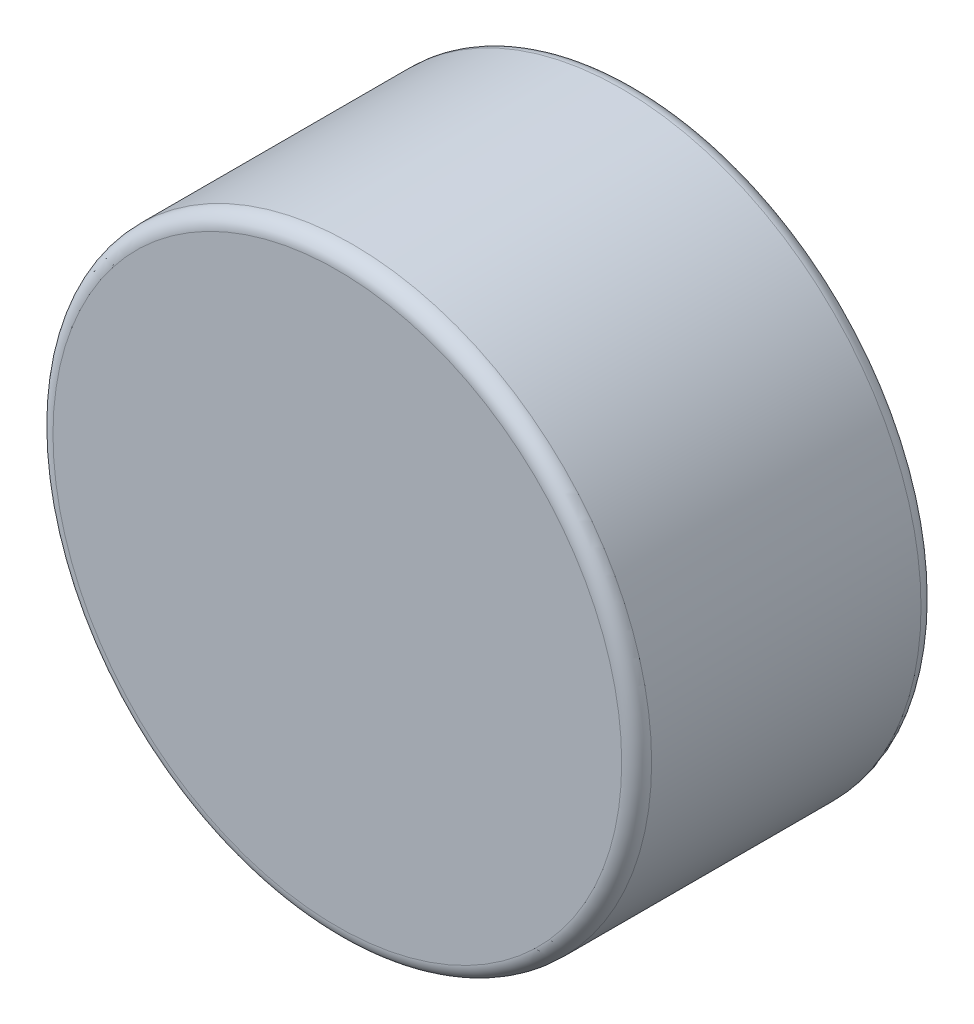
ISO-10303-21;
HEADER;
FILE_DESCRIPTION(('STEP AP214'),'2;1');
FILE_NAME('part.step','',(''),(''),'','','');
FILE_SCHEMA(('AUTOMOTIVE_DESIGN { 1 0 10303 214 1 1 1 1 }'));
ENDSEC;
DATA;
#1=APPLICATION_CONTEXT('core data for automotive mechanical design processes');
#2=APPLICATION_PROTOCOL_DEFINITION('international standard','automotive_design',2000,#1);
#3=PRODUCT_CONTEXT('',#1,'mechanical');
#4=PRODUCT('Part','Part','',(#3));
#5=PRODUCT_RELATED_PRODUCT_CATEGORY('part','',(#4));
#6=PRODUCT_DEFINITION_FORMATION('','',#4);
#7=PRODUCT_DEFINITION_CONTEXT('part definition',#1,'design');
#8=PRODUCT_DEFINITION('design','',#6,#7);
#9=PRODUCT_DEFINITION_SHAPE('','',#8);
#10=(LENGTH_UNIT() NAMED_UNIT(*) SI_UNIT(.MILLI.,.METRE.));
#11=(NAMED_UNIT(*) PLANE_ANGLE_UNIT() SI_UNIT($,.RADIAN.));
#12=(NAMED_UNIT(*) SI_UNIT($,.STERADIAN.) SOLID_ANGLE_UNIT());
#13=UNCERTAINTY_MEASURE_WITH_UNIT(LENGTH_MEASURE(1.E-05),#10,'distance_accuracy_value','');
#14=(GEOMETRIC_REPRESENTATION_CONTEXT(3) GLOBAL_UNCERTAINTY_ASSIGNED_CONTEXT((#13)) GLOBAL_UNIT_ASSIGNED_CONTEXT((#10,
#11,#12)) REPRESENTATION_CONTEXT('',''));
#15=CARTESIAN_POINT('',(0.,0.,0.));
#16=DIRECTION('',(0.,0.,1.));
#17=DIRECTION('',(1.,0.,0.));
#18=AXIS2_PLACEMENT_3D('',#15,#16,#17);
#19=CARTESIAN_POINT('',(0.,0.,0.));
#20=DIRECTION('',(0.,0.,-1.));
#21=DIRECTION('',(-1.,0.,0.));
#22=AXIS2_PLACEMENT_3D('',#19,#20,#21);
#23=PLANE('',#22);
#24=CARTESIAN_POINT('',(0.,0.,0.));
#25=DIRECTION('',(0.,0.,-1.));
#26=DIRECTION('',(-1.,0.,0.));
#27=AXIS2_PLACEMENT_3D('',#24,#25,#26);
#28=CIRCLE('',#27,1.9);
#29=CARTESIAN_POINT('',(-1.9,0.,0.));
#30=VERTEX_POINT('',#29);
#31=EDGE_CURVE('E10',#30,#30,#28,.F.);
#32=ORIENTED_EDGE('',*,*,#31,.T.);
#33=EDGE_LOOP('',(#32));
#34=FACE_BOUND('',#33,.T.);
#35=ADVANCED_FACE('F31',(#34),#23,.F.);
#36=CARTESIAN_POINT('',(0.,0.,9.21400778210117));
#37=DIRECTION('',(0.,0.,1.));
#38=DIRECTION('',(1.,0.,0.));
#39=AXIS2_PLACEMENT_3D('',#36,#37,#38);
#40=CYLINDRICAL_SURFACE('',#39,2.);
#41=CARTESIAN_POINT('',(0.,0.,-1.9));
#42=DIRECTION('',(0.,0.,1.));
#43=DIRECTION('',(1.,0.,0.));
#44=AXIS2_PLACEMENT_3D('',#41,#42,#43);
#45=CIRCLE('',#44,2.);
#46=CARTESIAN_POINT('',(2.,0.,-1.9));
#47=VERTEX_POINT('',#46);
#48=EDGE_CURVE('E42',#47,#47,#45,.T.);
#49=ORIENTED_EDGE('',*,*,#48,.T.);
#50=EDGE_LOOP('',(#49));
#51=FACE_BOUND('',#50,.T.);
#52=CARTESIAN_POINT('',(0.,0.,-0.0999999999999994));
#53=DIRECTION('',(0.,0.,-1.));
#54=DIRECTION('',(-1.,0.,0.));
#55=AXIS2_PLACEMENT_3D('',#52,#53,#54);
#56=CIRCLE('',#55,2.);
#57=CARTESIAN_POINT('',(-2.,0.,-0.0999999999999994));
#58=VERTEX_POINT('',#57);
#59=EDGE_CURVE('E46',#58,#58,#56,.T.);
#60=ORIENTED_EDGE('',*,*,#59,.T.);
#61=EDGE_LOOP('',(#60));
#62=FACE_BOUND('',#61,.T.);
#63=ADVANCED_FACE('F52',(#51,#62),#40,.T.);
#64=CARTESIAN_POINT('',(0.,0.,-2.));
#65=DIRECTION('',(0.,0.,1.));
#66=DIRECTION('',(1.,0.,0.));
#67=AXIS2_PLACEMENT_3D('',#64,#65,#66);
#68=PLANE('',#67);
#69=CARTESIAN_POINT('',(0.,0.,-2.));
#70=DIRECTION('',(0.,0.,1.));
#71=DIRECTION('',(1.,0.,0.));
#72=AXIS2_PLACEMENT_3D('',#69,#70,#71);
#73=CIRCLE('',#72,1.9);
#74=CARTESIAN_POINT('',(1.9,0.,-2.));
#75=VERTEX_POINT('',#74);
#76=EDGE_CURVE('E38',#75,#75,#73,.F.);
#77=ORIENTED_EDGE('',*,*,#76,.T.);
#78=EDGE_LOOP('',(#77));
#79=FACE_BOUND('',#78,.T.);
#80=ADVANCED_FACE('F60',(#79),#68,.F.);
#81=CARTESIAN_POINT('',(0.,0.,-1.9));
#82=DIRECTION('',(0.,0.,1.));
#83=DIRECTION('',(1.,0.,0.));
#84=AXIS2_PLACEMENT_3D('',#81,#82,#83);
#85=TOROIDAL_SURFACE('',#84,1.9,0.1);
#86=ORIENTED_EDGE('',*,*,#76,.F.);
#87=EDGE_LOOP('',(#86));
#88=FACE_BOUND('',#87,.T.);
#89=ORIENTED_EDGE('',*,*,#48,.F.);
#90=EDGE_LOOP('',(#89));
#91=FACE_BOUND('',#90,.T.);
#92=ADVANCED_FACE('F56',(#88,#91),#85,.T.);
#93=CARTESIAN_POINT('',(0.,0.,-0.0999999999999994));
#94=DIRECTION('',(0.,0.,-1.));
#95=DIRECTION('',(-1.,0.,0.));
#96=AXIS2_PLACEMENT_3D('',#93,#94,#95);
#97=TOROIDAL_SURFACE('',#96,1.9,0.1);
#98=ORIENTED_EDGE('',*,*,#59,.F.);
#99=EDGE_LOOP('',(#98));
#100=FACE_BOUND('',#99,.T.);
#101=ORIENTED_EDGE('',*,*,#31,.F.);
#102=EDGE_LOOP('',(#101));
#103=FACE_BOUND('',#102,.T.);
#104=ADVANCED_FACE('F33',(#100,#103),#97,.T.);
#105=CLOSED_SHELL('',(#35,#63,#80,#92,#104));
#106=MANIFOLD_SOLID_BREP('B2',#105);
#107=ADVANCED_BREP_SHAPE_REPRESENTATION('',(#18,#106),#14);
#108=SHAPE_DEFINITION_REPRESENTATION(#9,#107);
ENDSEC;
END-ISO-10303-21;
